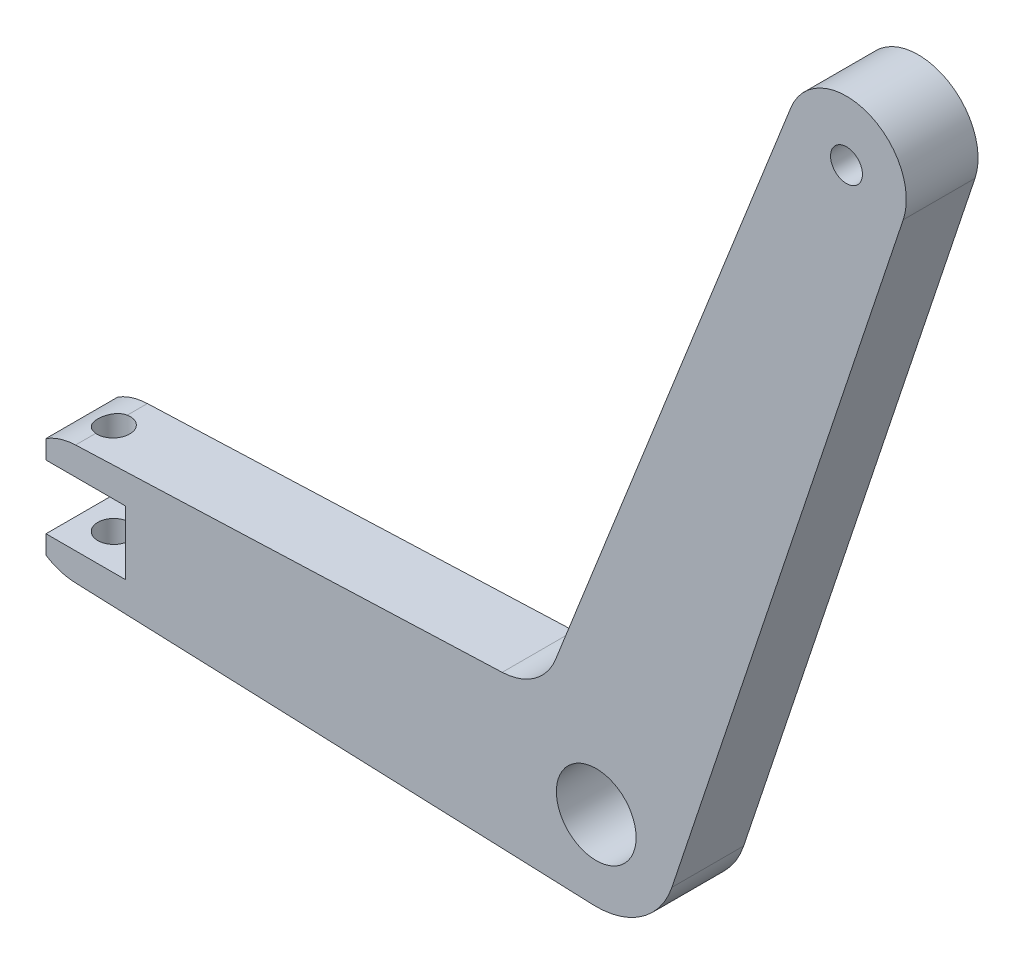
ISO-10303-21;
HEADER;
FILE_DESCRIPTION(('STEP AP214'),'2;1');
FILE_NAME('part.step','',(''),(''),'','','');
FILE_SCHEMA(('AUTOMOTIVE_DESIGN { 1 0 10303 214 1 1 1 1 }'));
ENDSEC;
DATA;
#1=APPLICATION_CONTEXT('core data for automotive mechanical design processes');
#2=APPLICATION_PROTOCOL_DEFINITION('international standard','automotive_design',2000,#1);
#3=PRODUCT_CONTEXT('',#1,'mechanical');
#4=PRODUCT('Part','Part','',(#3));
#5=PRODUCT_RELATED_PRODUCT_CATEGORY('part','',(#4));
#6=PRODUCT_DEFINITION_FORMATION('','',#4);
#7=PRODUCT_DEFINITION_CONTEXT('part definition',#1,'design');
#8=PRODUCT_DEFINITION('design','',#6,#7);
#9=PRODUCT_DEFINITION_SHAPE('','',#8);
#10=(LENGTH_UNIT() NAMED_UNIT(*) SI_UNIT(.MILLI.,.METRE.));
#11=(NAMED_UNIT(*) PLANE_ANGLE_UNIT() SI_UNIT($,.RADIAN.));
#12=(NAMED_UNIT(*) SI_UNIT($,.STERADIAN.) SOLID_ANGLE_UNIT());
#13=UNCERTAINTY_MEASURE_WITH_UNIT(LENGTH_MEASURE(1.E-05),#10,'distance_accuracy_value','');
#14=(GEOMETRIC_REPRESENTATION_CONTEXT(3) GLOBAL_UNCERTAINTY_ASSIGNED_CONTEXT((#13)) GLOBAL_UNIT_ASSIGNED_CONTEXT((#10,
#11,#12)) REPRESENTATION_CONTEXT('',''));
#15=CARTESIAN_POINT('',(0.,0.,0.));
#16=DIRECTION('',(0.,0.,1.));
#17=DIRECTION('',(1.,0.,0.));
#18=AXIS2_PLACEMENT_3D('',#15,#16,#17);
#19=CARTESIAN_POINT('',(-130.000001063068,0.,18.));
#20=DIRECTION('',(0.,0.,-1.));
#21=DIRECTION('',(-1.,0.,0.));
#22=AXIS2_PLACEMENT_3D('',#19,#20,#21);
#23=CYLINDRICAL_SURFACE('',#22,15.0000275579297);
#24=DIRECTION('',(0.,0.,-1.));
#25=VECTOR('',#24,1.);
#26=CARTESIAN_POINT('',(-138.000001063068,-12.6886101184744,18.));
#27=LINE('',#26,#25);
#28=CARTESIAN_POINT('',(-138.000001063068,-12.6886101184744,0.));
#29=VERTEX_POINT('',#28);
#30=CARTESIAN_POINT('',(-138.000001063068,-12.6886101184744,18.));
#31=VERTEX_POINT('',#30);
#32=EDGE_CURVE('E159',#29,#31,#27,.F.);
#33=ORIENTED_EDGE('',*,*,#32,.F.);
#34=CARTESIAN_POINT('',(-130.000001063068,0.,0.));
#35=DIRECTION('',(0.,0.,1.));
#36=DIRECTION('',(1.,0.,0.));
#37=AXIS2_PLACEMENT_3D('',#34,#35,#36);
#38=CIRCLE('',#37,15.0000275579297);
#39=CARTESIAN_POINT('',(-130.000001063068,-15.0000275579298,0.));
#40=VERTEX_POINT('',#39);
#41=EDGE_CURVE('E170',#29,#40,#38,.T.);
#42=ORIENTED_EDGE('',*,*,#41,.T.);
#43=DIRECTION('',(0.,0.,-1.));
#44=VECTOR('',#43,1.);
#45=CARTESIAN_POINT('',(-130.000001063068,-15.0000275579298,18.));
#46=LINE('',#45,#44);
#47=CARTESIAN_POINT('',(-130.000001063068,-15.0000275579298,5.00000000000015));
#48=VERTEX_POINT('',#47);
#49=EDGE_CURVE('E230',#48,#40,#46,.T.);
#50=ORIENTED_EDGE('',*,*,#49,.F.);
#51=CARTESIAN_POINT('',(-130.000001063068,-15.0000275579298,5.00000000000015));
#52=CARTESIAN_POINT('',(-130.110429979527,-15.000039127608,4.99998710210949));
#53=CARTESIAN_POINT('',(-130.220851327361,-14.9988083685536,5.00457281445147));
#54=CARTESIAN_POINT('',(-130.440867637331,-14.9939480538143,5.02284115458803));
#55=CARTESIAN_POINT('',(-130.550462736132,-14.9903189040452,5.03652224303738));
#56=CARTESIAN_POINT('',(-130.767830100226,-14.9807574286043,5.07284381274536));
#57=CARTESIAN_POINT('',(-130.875605642702,-14.9748298412933,5.09546586353631));
#58=CARTESIAN_POINT('',(-131.088771871688,-14.9608434648072,5.14945702650422));
#59=CARTESIAN_POINT('',(-131.194162525994,-14.9527846468714,5.18082625672313));
#60=CARTESIAN_POINT('',(-131.505635331047,-14.9257204333376,5.28770552813249));
#61=CARTESIAN_POINT('',(-131.707238194944,-14.9038169628393,5.37602423892251));
#62=CARTESIAN_POINT('',(-132.092702241525,-14.854606649301,5.58405724353521));
#63=CARTESIAN_POINT('',(-132.276558369622,-14.827298273564,5.70378044603293));
#64=CARTESIAN_POINT('',(-132.625644617796,-14.7695216039759,5.97416095273756));
#65=CARTESIAN_POINT('',(-132.790410472174,-14.7389996068464,6.12540722019662));
#66=CARTESIAN_POINT('',(-133.092568145137,-14.6785783796406,6.45328642458111));
#67=CARTESIAN_POINT('',(-133.22995455202,-14.6486792737261,6.62992436846132));
#68=CARTESIAN_POINT('',(-133.475731288655,-14.592338477779,7.00730226629842));
#69=CARTESIAN_POINT('',(-133.583583379343,-14.5659649492993,7.20840390975125));
#70=CARTESIAN_POINT('',(-133.763755229574,-14.520457203446,7.62669239863236));
#71=CARTESIAN_POINT('',(-133.836083311216,-14.5013212907803,7.84387546298362));
#72=CARTESIAN_POINT('',(-133.941538010621,-14.473011261013,8.28298992356108));
#73=CARTESIAN_POINT('',(-133.97551280972,-14.463621991182,8.50470341515122));
#74=CARTESIAN_POINT('',(-134.005940786888,-14.4552254853716,8.95087166682879));
#75=CARTESIAN_POINT('',(-134.002400140865,-14.4562165405512,9.17532596963881));
#76=CARTESIAN_POINT('',(-133.958569936521,-14.4682765182348,9.61397316821439));
#77=CARTESIAN_POINT('',(-133.919307630436,-14.4790637157923,9.82827768856916));
#78=CARTESIAN_POINT('',(-133.806793662827,-14.5090493428616,10.2471400543677));
#79=CARTESIAN_POINT('',(-133.733539610309,-14.5282483640598,10.4516972130612));
#80=CARTESIAN_POINT('',(-133.554286161926,-14.5731422138998,10.847939397374));
#81=CARTESIAN_POINT('',(-133.447926259859,-14.5989079619843,11.0394529393475));
#82=CARTESIAN_POINT('',(-133.205723959009,-14.6539940141355,11.4022740634708));
#83=CARTESIAN_POINT('',(-133.069876352553,-14.6833149456607,11.5735780682588));
#84=CARTESIAN_POINT('',(-132.767356632831,-14.7433747419667,11.8969578021659));
#85=CARTESIAN_POINT('',(-132.599825837379,-14.7741287110214,12.0482271550295));
#86=CARTESIAN_POINT('',(-132.241240303049,-14.8327523489024,12.3207663750534));
#87=CARTESIAN_POINT('',(-132.050179593653,-14.8606212823597,12.4420286045719));
#88=CARTESIAN_POINT('',(-131.749573939648,-14.8979922768469,12.5988768651268));
#89=CARTESIAN_POINT('',(-131.646709330984,-14.909738799854,12.6470911188178));
#90=CARTESIAN_POINT('',(-131.437099987471,-14.931397910713,12.734651230049));
#91=CARTESIAN_POINT('',(-131.3303568285,-14.9413112336521,12.7740006436528));
#92=CARTESIAN_POINT('',(-131.113862348789,-14.9590083309113,12.8434656421793));
#93=CARTESIAN_POINT('',(-131.004114171044,-14.9667942432556,12.8735905013809));
#94=CARTESIAN_POINT('',(-130.782357399181,-14.9800225138778,12.9243912461448));
#95=CARTESIAN_POINT('',(-130.670349871879,-14.9854659523044,12.9450714870277));
#96=CARTESIAN_POINT('',(-130.465259759482,-14.9930950512655,12.973944438159));
#97=CARTESIAN_POINT('',(-130.37241149341,-14.9956914544691,12.9837176224702));
#98=CARTESIAN_POINT('',(-130.186378297925,-14.9991591566028,12.9967431381919));
#99=CARTESIAN_POINT('',(-130.093194158364,-15.0000332455,13.0000060157202));
#100=CARTESIAN_POINT('',(-130.000001063068,-15.0000275579298,12.9999999999999));
#101=B_SPLINE_CURVE_WITH_KNOTS('',3,(#51,#52,#53,#54,#55,#56,#57,#58,#59,#60,#61,#62,#63,#64,
#65,#66,#67,#68,#69,#70,#71,#72,#73,#74,#75,#76,#77,#78,#79,#80,#81,#82,#83,#84,#85,#86,#87,#88,
#89,#90,#91,#92,#93,#94,#95,#96,#97,#98,#99,#100),.UNSPECIFIED.,.F.,.F.,(4,2,2,2,2,2,2,2,2,2,2,
2,2,2,2,2,2,2,2,2,2,2,2,2,4),(0.,0.331171669252462,0.662287303681064,0.992723922700853,
1.32316500113235,1.98338593550836,2.64379436110598,3.3178713990858,3.99208154032271,
4.67786534361418,5.36348841374275,6.03363222862638,6.70366572409995,7.35501976590737,
8.0064196312035,8.66517691308053,9.32405062950442,10.0043489690313,10.6848202855829,
11.0270976322766,11.3692374315536,11.7110321087008,12.0526690100435,12.3326239708219,
12.6121250600858),.UNSPECIFIED.);
#102=CARTESIAN_POINT('',(-130.000001063068,-15.0000275579298,12.9999999999999));
#103=VERTEX_POINT('',#102);
#104=EDGE_CURVE('E254',#48,#103,#101,.T.);
#105=ORIENTED_EDGE('',*,*,#104,.T.);
#106=CARTESIAN_POINT('',(-130.000001063068,-15.0000275579298,18.));
#107=VERTEX_POINT('',#106);
#108=EDGE_CURVE('E231',#107,#103,#46,.T.);
#109=ORIENTED_EDGE('',*,*,#108,.F.);
#110=CARTESIAN_POINT('',(-130.000001063068,0.,18.));
#111=DIRECTION('',(0.,0.,1.));
#112=DIRECTION('',(1.,0.,0.));
#113=AXIS2_PLACEMENT_3D('',#110,#111,#112);
#114=CIRCLE('',#113,15.0000275579297);
#115=EDGE_CURVE('E173',#31,#107,#114,.T.);
#116=ORIENTED_EDGE('',*,*,#115,.F.);
#117=EDGE_LOOP('',(#33,#42,#50,#105,#109,#116));
#118=FACE_BOUND('',#117,.T.);
#119=ADVANCED_FACE('F45',(#118),#23,.T.);
#120=DIRECTION('',(0.,0.,-1.));
#121=VECTOR('',#120,1.);
#122=CARTESIAN_POINT('',(-138.000001063068,12.6886101184744,18.));
#123=LINE('',#122,#121);
#124=CARTESIAN_POINT('',(-138.000001063068,12.6886101184744,18.));
#125=VERTEX_POINT('',#124);
#126=CARTESIAN_POINT('',(-138.000001063068,12.6886101184744,0.));
#127=VERTEX_POINT('',#126);
#128=EDGE_CURVE('E176',#125,#127,#123,.T.);
#129=ORIENTED_EDGE('',*,*,#128,.F.);
#130=CARTESIAN_POINT('',(-130.576922015427,14.9889288794557,18.));
#131=VERTEX_POINT('',#130);
#132=EDGE_CURVE('E343',#131,#125,#114,.T.);
#133=ORIENTED_EDGE('',*,*,#132,.F.);
#134=DIRECTION('',(0.,0.,-1.));
#135=VECTOR('',#134,1.);
#136=CARTESIAN_POINT('',(-130.576922015427,14.9889288794557,18.));
#137=LINE('',#136,#135);
#138=CARTESIAN_POINT('',(-130.576922015427,14.9889288794557,12.9581764725838));
#139=VERTEX_POINT('',#138);
#140=EDGE_CURVE('E236',#131,#139,#137,.T.);
#141=ORIENTED_EDGE('',*,*,#140,.T.);
#142=CARTESIAN_POINT('',(-130.576922015427,14.9889288794557,12.9581764725838));
#143=CARTESIAN_POINT('',(-130.68744737672,14.9846857074771,12.9420793196555));
#144=CARTESIAN_POINT('',(-130.797237430832,14.9792249173227,12.9213372040548));
#145=CARTESIAN_POINT('',(-131.014553238792,14.9660706943105,12.8708007940338));
#146=CARTESIAN_POINT('',(-131.122079486553,14.9583777539882,12.8410084965156));
#147=CARTESIAN_POINT('',(-131.333922380723,14.9409762891631,12.7726670196509));
#148=CARTESIAN_POINT('',(-131.438244726399,14.9312716141547,12.7341345517171));
#149=CARTESIAN_POINT('',(-131.643151036713,14.9101144161627,12.6486156236661));
#150=CARTESIAN_POINT('',(-131.743734882611,14.8986618377221,12.6016288953062));
#151=CARTESIAN_POINT('',(-132.038790088411,14.8621426053324,12.448523864488));
#152=CARTESIAN_POINT('',(-132.226825900542,14.8348918851816,12.3301761052217));
#153=CARTESIAN_POINT('',(-132.580445171669,14.7774952580895,12.0643641359232));
#154=CARTESIAN_POINT('',(-132.746021576904,14.7473484466359,11.9168908140609));
#155=CARTESIAN_POINT('',(-133.05382606557,14.68673230827,11.5932622575332));
#156=CARTESIAN_POINT('',(-133.195496524582,14.6562693263655,11.4165739851939));
#157=CARTESIAN_POINT('',(-133.447271614939,14.5991056780792,11.0414111477276));
#158=CARTESIAN_POINT('',(-133.557375240863,14.5724051315471,10.84293588895));
#159=CARTESIAN_POINT('',(-133.742596685806,14.5259410030507,10.4297403805196));
#160=CARTESIAN_POINT('',(-133.817751530188,14.5061700852101,10.2150376043137));
#161=CARTESIAN_POINT('',(-133.930676487137,14.4759830979541,9.7754053807407));
#162=CARTESIAN_POINT('',(-133.968457330881,14.4655643433365,9.55047888831664));
#163=CARTESIAN_POINT('',(-134.00468377711,14.4555760640433,9.10455838942624));
#164=CARTESIAN_POINT('',(-134.004357469081,14.4556678126625,8.88367116062964));
#165=CARTESIAN_POINT('',(-133.967441662279,14.4658425120589,8.44519650542797));
#166=CARTESIAN_POINT('',(-133.930853938209,14.4759249738719,8.2276089180614));
#167=CARTESIAN_POINT('',(-133.823361488348,14.504680345966,7.80461310920813));
#168=CARTESIAN_POINT('',(-133.752888893297,14.5232449399075,7.59908713242325));
#169=CARTESIAN_POINT('',(-133.580005288652,14.5668221124717,7.20268477654072));
#170=CARTESIAN_POINT('',(-133.477589806186,14.5918355940291,7.01181045374053));
#171=CARTESIAN_POINT('',(-133.240493108599,14.6463364563778,6.6445280670213));
#172=CARTESIAN_POINT('',(-133.105017160167,14.6759261895577,6.46864809081482));
#173=CARTESIAN_POINT('',(-132.806966265238,14.7358364926685,6.14169032310027));
#174=CARTESIAN_POINT('',(-132.644382268153,14.7661573037833,5.99062084864646));
#175=CARTESIAN_POINT('',(-132.291700735117,14.8250309889236,5.71373695717913));
#176=CARTESIAN_POINT('',(-132.101015854785,14.853520523924,5.58865023361676));
#177=CARTESIAN_POINT('',(-131.801020610469,14.8918565018312,5.42658547359376));
#178=CARTESIAN_POINT('',(-131.698696614495,14.9039018902928,5.37682558844982));
#179=CARTESIAN_POINT('',(-131.490028546574,14.9262062619696,5.28614286866096));
#180=CARTESIAN_POINT('',(-131.383685974446,14.9364659038044,5.24521677459258));
#181=CARTESIAN_POINT('',(-131.162142030628,14.9553742241694,5.17066863905417));
#182=CARTESIAN_POINT('',(-131.04676701371,14.9639120524243,5.1375342150036));
#183=CARTESIAN_POINT('',(-130.813515605507,14.9784102218698,5.08176218519333));
#184=CARTESIAN_POINT('',(-130.695642793137,14.9843740196503,5.05911049949937));
#185=CARTESIAN_POINT('',(-130.576922015427,14.9889288794557,5.04182352741618));
#186=B_SPLINE_CURVE_WITH_KNOTS('',3,(#142,#143,#144,#145,#146,#147,#148,#149,#150,#151,#152,
#153,#154,#155,#156,#157,#158,#159,#160,#161,#162,#163,#164,#165,#166,#167,#168,#169,#170,#171,
#172,#173,#174,#175,#176,#177,#178,#179,#180,#181,#182,#183,#184,#185),.UNSPECIFIED.,.F.,.F.,(4,
2,2,2,2,2,2,2,2,2,2,2,2,2,2,2,2,2,2,2,2,4),(0.,0.335192644075447,0.670311382300934,
1.0047946875275,1.33928860734079,2.00746147417339,2.67584370861998,3.35813590505799,
4.04044983050835,4.72203924429065,5.40343289679829,6.06287334987864,6.72228153029949,
7.37349481277645,8.02479932380347,8.69364569048698,9.3627158143066,10.0485513992621,
10.3914540959462,10.7342300539617,11.0947455606754,11.4547754239235),.UNSPECIFIED.);
#187=CARTESIAN_POINT('',(-130.576922015427,14.9889288794557,5.04182352741619));
#188=VERTEX_POINT('',#187);
#189=EDGE_CURVE('E259',#139,#188,#186,.T.);
#190=ORIENTED_EDGE('',*,*,#189,.T.);
#191=CARTESIAN_POINT('',(-130.576922015427,14.9889288794557,0.));
#192=VERTEX_POINT('',#191);
#193=EDGE_CURVE('E235',#188,#192,#137,.T.);
#194=ORIENTED_EDGE('',*,*,#193,.T.);
#195=EDGE_CURVE('E183',#192,#127,#38,.T.);
#196=ORIENTED_EDGE('',*,*,#195,.T.);
#197=EDGE_LOOP('',(#129,#133,#141,#190,#194,#196));
#198=FACE_BOUND('',#197,.T.);
#199=ADVANCED_FACE('F304',(#198),#23,.T.);
#200=CARTESIAN_POINT('',(-24.1604405382243,34.0959853951472,18.));
#201=DIRECTION('',(0.,0.,-1.));
#202=DIRECTION('',(-1.,0.,0.));
#203=AXIS2_PLACEMENT_3D('',#200,#201,#202);
#204=PLANE('',#203);
#205=CARTESIAN_POINT('',(0.,0.,18.));
#206=DIRECTION('',(0.,0.,1.));
#207=DIRECTION('',(1.,0.,0.));
#208=AXIS2_PLACEMENT_3D('',#205,#206,#207);
#209=CIRCLE('',#208,10.);
#210=CARTESIAN_POINT('',(10.,0.,18.));
#211=VERTEX_POINT('',#210);
#212=EDGE_CURVE('E374',#211,#211,#209,.T.);
#213=ORIENTED_EDGE('',*,*,#212,.F.);
#214=EDGE_LOOP('',(#213));
#215=FACE_BOUND('',#214,.T.);
#216=CARTESIAN_POINT('',(62.7606963002596,172.433595914214,18.));
#217=DIRECTION('',(0.,0.,1.));
#218=DIRECTION('',(1.,0.,0.));
#219=AXIS2_PLACEMENT_3D('',#216,#217,#218);
#220=CIRCLE('',#219,4.00000000000001);
#221=CARTESIAN_POINT('',(66.7606963002596,172.433595914214,18.));
#222=VERTEX_POINT('',#221);
#223=EDGE_CURVE('E391',#222,#222,#220,.T.);
#224=ORIENTED_EDGE('',*,*,#223,.F.);
#225=EDGE_LOOP('',(#224));
#226=FACE_BOUND('',#225,.T.);
#227=DIRECTION('',(0.,1.,0.));
#228=VECTOR('',#227,1.);
#229=CARTESIAN_POINT('',(-138.000001063068,20.,18.));
#230=LINE('',#229,#228);
#231=CARTESIAN_POINT('',(-138.000001063068,-8.,18.));
#232=VERTEX_POINT('',#231);
#233=EDGE_CURVE('E61',#31,#232,#230,.T.);
#234=ORIENTED_EDGE('',*,*,#233,.F.);
#235=ORIENTED_EDGE('',*,*,#115,.T.);
#236=DIRECTION('',(0.999256785054639,-0.0385470818904151,0.));
#237=VECTOR('',#236,1.);
#238=CARTESIAN_POINT('',(-130.000001063068,-15.0000275579298,18.));
#239=LINE('',#238,#237);
#240=CARTESIAN_POINT('',(-0.770941637808299,-19.9851357010928,18.));
#241=VERTEX_POINT('',#240);
#242=EDGE_CURVE('E354',#107,#241,#239,.T.);
#243=ORIENTED_EDGE('',*,*,#242,.T.);
#244=CARTESIAN_POINT('',(0.,0.,18.));
#245=DIRECTION('',(0.,0.,1.));
#246=DIRECTION('',(1.,0.,0.));
#247=AXIS2_PLACEMENT_3D('',#244,#245,#246);
#248=CIRCLE('',#247,20.);
#249=CARTESIAN_POINT('',(18.973261360885,-6.3257689913201,18.));
#250=VERTEX_POINT('',#249);
#251=EDGE_CURVE('E358',#241,#250,#248,.T.);
#252=ORIENTED_EDGE('',*,*,#251,.T.);
#253=DIRECTION('',(0.316288449566005,0.948663068044252,0.));
#254=VECTOR('',#253,1.);
#255=CARTESIAN_POINT('',(76.9906423209235,167.689269170724,18.));
#256=LINE('',#255,#254);
#257=CARTESIAN_POINT('',(76.9906423209235,167.689269170724,18.));
#258=VERTEX_POINT('',#257);
#259=EDGE_CURVE('E365',#250,#258,#256,.T.);
#260=ORIENTED_EDGE('',*,*,#259,.T.);
#261=CARTESIAN_POINT('',(62.7606963002597,172.433595914214,18.));
#262=DIRECTION('',(0.,0.,1.));
#263=DIRECTION('',(1.,0.,0.));
#264=AXIS2_PLACEMENT_3D('',#261,#262,#263);
#265=CIRCLE('',#264,15.);
#266=CARTESIAN_POINT('',(48.8103307782272,177.946063764614,18.));
#267=VERTEX_POINT('',#266);
#268=EDGE_CURVE('E368',#258,#267,#265,.T.);
#269=ORIENTED_EDGE('',*,*,#268,.T.);
#270=DIRECTION('',(-0.367497856693302,-0.930024368135496,0.));
#271=VECTOR('',#270,1.);
#272=CARTESIAN_POINT('',(48.8103307782272,177.946063764614,18.));
#273=LINE('',#272,#271);
#274=CARTESIAN_POINT('',(-10.2100750161918,28.5835175447477,18.));
#275=VERTEX_POINT('',#274);
#276=EDGE_CURVE('E214',#267,#275,#273,.T.);
#277=ORIENTED_EDGE('',*,*,#276,.T.);
#278=CARTESIAN_POINT('',(-24.1604405382243,34.0959853951472,18.));
#279=DIRECTION('',(0.,0.,-1.));
#280=DIRECTION('',(-1.,0.,0.));
#281=AXIS2_PLACEMENT_3D('',#278,#279,#280);
#282=CIRCLE('',#281,15.);
#283=CARTESIAN_POINT('',(-23.5835206457801,19.1070840532308,18.));
#284=VERTEX_POINT('',#283);
#285=EDGE_CURVE('E208',#275,#284,#282,.T.);
#286=ORIENTED_EDGE('',*,*,#285,.T.);
#287=DIRECTION('',(-0.999260089461091,-0.0384613261629483,0.));
#288=VECTOR('',#287,1.);
#289=CARTESIAN_POINT('',(-130.576922015427,14.9889288794557,18.));
#290=LINE('',#289,#288);
#291=EDGE_CURVE('E351',#284,#131,#290,.T.);
#292=ORIENTED_EDGE('',*,*,#291,.T.);
#293=ORIENTED_EDGE('',*,*,#132,.T.);
#294=CARTESIAN_POINT('',(-138.000001063068,8.,18.));
#295=VERTEX_POINT('',#294);
#296=EDGE_CURVE('E165',#295,#125,#230,.T.);
#297=ORIENTED_EDGE('',*,*,#296,.F.);
#298=DIRECTION('',(1.,0.,0.));
#299=VECTOR('',#298,1.);
#300=CARTESIAN_POINT('',(-146.,8.,18.));
#301=LINE('',#300,#299);
#302=CARTESIAN_POINT('',(-118.,8.,18.));
#303=VERTEX_POINT('',#302);
#304=EDGE_CURVE('E548',#295,#303,#301,.T.);
#305=ORIENTED_EDGE('',*,*,#304,.T.);
#306=DIRECTION('',(0.,-1.,0.));
#307=VECTOR('',#306,1.);
#308=CARTESIAN_POINT('',(-118.,-8.,18.));
#309=LINE('',#308,#307);
#310=CARTESIAN_POINT('',(-118.,-8.,18.));
#311=VERTEX_POINT('',#310);
#312=EDGE_CURVE('E541',#303,#311,#309,.T.);
#313=ORIENTED_EDGE('',*,*,#312,.T.);
#314=DIRECTION('',(1.,0.,0.));
#315=VECTOR('',#314,1.);
#316=CARTESIAN_POINT('',(-146.,-8.,18.));
#317=LINE('',#316,#315);
#318=EDGE_CURVE('E251',#232,#311,#317,.T.);
#319=ORIENTED_EDGE('',*,*,#318,.F.);
#320=EDGE_LOOP('',(#234,#235,#243,#252,#260,#269,#277,#286,#292,#293,#297,#305,#313,#319));
#321=FACE_BOUND('',#320,.T.);
#322=ADVANCED_FACE('F301',(#215,#226,#321),#204,.F.);
#323=CARTESIAN_POINT('',(-24.1604405382243,34.0959853951472,0.));
#324=DIRECTION('',(0.,0.,-1.));
#325=DIRECTION('',(-1.,0.,0.));
#326=AXIS2_PLACEMENT_3D('',#323,#324,#325);
#327=PLANE('',#326);
#328=CARTESIAN_POINT('',(0.,0.,0.));
#329=DIRECTION('',(0.,0.,1.));
#330=DIRECTION('',(1.,0.,0.));
#331=AXIS2_PLACEMENT_3D('',#328,#329,#330);
#332=CIRCLE('',#331,10.);
#333=CARTESIAN_POINT('',(10.,0.,0.));
#334=VERTEX_POINT('',#333);
#335=EDGE_CURVE('E380',#334,#334,#332,.T.);
#336=ORIENTED_EDGE('',*,*,#335,.T.);
#337=EDGE_LOOP('',(#336));
#338=FACE_BOUND('',#337,.T.);
#339=CARTESIAN_POINT('',(62.7606963002596,172.433595914214,0.));
#340=DIRECTION('',(0.,0.,1.));
#341=DIRECTION('',(1.,0.,0.));
#342=AXIS2_PLACEMENT_3D('',#339,#340,#341);
#343=CIRCLE('',#342,4.00000000000001);
#344=CARTESIAN_POINT('',(66.7606963002596,172.433595914214,0.));
#345=VERTEX_POINT('',#344);
#346=EDGE_CURVE('E385',#345,#345,#343,.T.);
#347=ORIENTED_EDGE('',*,*,#346,.T.);
#348=EDGE_LOOP('',(#347));
#349=FACE_BOUND('',#348,.T.);
#350=ORIENTED_EDGE('',*,*,#41,.F.);
#351=DIRECTION('',(0.,1.,0.));
#352=VECTOR('',#351,1.);
#353=CARTESIAN_POINT('',(-138.000001063068,20.,0.));
#354=LINE('',#353,#352);
#355=CARTESIAN_POINT('',(-138.000001063068,-8.,0.));
#356=VERTEX_POINT('',#355);
#357=EDGE_CURVE('E156',#29,#356,#354,.T.);
#358=ORIENTED_EDGE('',*,*,#357,.T.);
#359=DIRECTION('',(1.,0.,0.));
#360=VECTOR('',#359,1.);
#361=CARTESIAN_POINT('',(-146.,-8.,0.));
#362=LINE('',#361,#360);
#363=CARTESIAN_POINT('',(-118.,-8.,0.));
#364=VERTEX_POINT('',#363);
#365=EDGE_CURVE('E272',#356,#364,#362,.T.);
#366=ORIENTED_EDGE('',*,*,#365,.T.);
#367=DIRECTION('',(0.,1.,0.));
#368=VECTOR('',#367,1.);
#369=CARTESIAN_POINT('',(-118.,8.,0.));
#370=LINE('',#369,#368);
#371=CARTESIAN_POINT('',(-118.,8.,0.));
#372=VERTEX_POINT('',#371);
#373=EDGE_CURVE('E543',#364,#372,#370,.T.);
#374=ORIENTED_EDGE('',*,*,#373,.T.);
#375=DIRECTION('',(1.,0.,0.));
#376=VECTOR('',#375,1.);
#377=CARTESIAN_POINT('',(-146.,8.,0.));
#378=LINE('',#377,#376);
#379=CARTESIAN_POINT('',(-138.000001063068,8.,0.));
#380=VERTEX_POINT('',#379);
#381=EDGE_CURVE('E555',#380,#372,#378,.T.);
#382=ORIENTED_EDGE('',*,*,#381,.F.);
#383=EDGE_CURVE('E68',#380,#127,#354,.T.);
#384=ORIENTED_EDGE('',*,*,#383,.T.);
#385=ORIENTED_EDGE('',*,*,#195,.F.);
#386=DIRECTION('',(-0.999260089461091,-0.0384613261629483,0.));
#387=VECTOR('',#386,1.);
#388=CARTESIAN_POINT('',(-130.576922015427,14.9889288794557,0.));
#389=LINE('',#388,#387);
#390=CARTESIAN_POINT('',(-23.5835206457801,19.1070840532308,0.));
#391=VERTEX_POINT('',#390);
#392=EDGE_CURVE('E184',#391,#192,#389,.T.);
#393=ORIENTED_EDGE('',*,*,#392,.F.);
#394=CARTESIAN_POINT('',(-24.1604405382243,34.0959853951472,0.));
#395=DIRECTION('',(0.,0.,-1.));
#396=DIRECTION('',(-1.,0.,0.));
#397=AXIS2_PLACEMENT_3D('',#394,#395,#396);
#398=CIRCLE('',#397,15.);
#399=CARTESIAN_POINT('',(-10.2100750161918,28.5835175447477,0.));
#400=VERTEX_POINT('',#399);
#401=EDGE_CURVE('E190',#400,#391,#398,.T.);
#402=ORIENTED_EDGE('',*,*,#401,.F.);
#403=DIRECTION('',(-0.367497856693302,-0.930024368135496,0.));
#404=VECTOR('',#403,1.);
#405=CARTESIAN_POINT('',(48.8103307782272,177.946063764614,0.));
#406=LINE('',#405,#404);
#407=CARTESIAN_POINT('',(48.8103307782272,177.946063764614,0.));
#408=VERTEX_POINT('',#407);
#409=EDGE_CURVE('E205',#408,#400,#406,.T.);
#410=ORIENTED_EDGE('',*,*,#409,.F.);
#411=CARTESIAN_POINT('',(62.7606963002597,172.433595914214,0.));
#412=DIRECTION('',(0.,0.,1.));
#413=DIRECTION('',(1.,0.,0.));
#414=AXIS2_PLACEMENT_3D('',#411,#412,#413);
#415=CIRCLE('',#414,15.);
#416=CARTESIAN_POINT('',(76.9906423209235,167.689269170724,0.));
#417=VERTEX_POINT('',#416);
#418=EDGE_CURVE('E202',#417,#408,#415,.T.);
#419=ORIENTED_EDGE('',*,*,#418,.F.);
#420=DIRECTION('',(0.316288449566005,0.948663068044252,0.));
#421=VECTOR('',#420,1.);
#422=CARTESIAN_POINT('',(76.9906423209235,167.689269170724,0.));
#423=LINE('',#422,#421);
#424=CARTESIAN_POINT('',(18.973261360885,-6.3257689913201,0.));
#425=VERTEX_POINT('',#424);
#426=EDGE_CURVE('E199',#425,#417,#423,.T.);
#427=ORIENTED_EDGE('',*,*,#426,.F.);
#428=CARTESIAN_POINT('',(0.,0.,0.));
#429=DIRECTION('',(0.,0.,1.));
#430=DIRECTION('',(1.,0.,0.));
#431=AXIS2_PLACEMENT_3D('',#428,#429,#430);
#432=CIRCLE('',#431,20.);
#433=CARTESIAN_POINT('',(-0.770941637808299,-19.9851357010928,0.));
#434=VERTEX_POINT('',#433);
#435=EDGE_CURVE('E196',#434,#425,#432,.T.);
#436=ORIENTED_EDGE('',*,*,#435,.F.);
#437=DIRECTION('',(0.999256785054639,-0.0385470818904151,0.));
#438=VECTOR('',#437,1.);
#439=CARTESIAN_POINT('',(-130.000001063068,-15.0000275579298,0.));
#440=LINE('',#439,#438);
#441=EDGE_CURVE('E181',#40,#434,#440,.T.);
#442=ORIENTED_EDGE('',*,*,#441,.F.);
#443=EDGE_LOOP('',(#350,#358,#366,#374,#382,#384,#385,#393,#402,#410,#419,#427,#436,#442));
#444=FACE_BOUND('',#443,.T.);
#445=ADVANCED_FACE('F179',(#338,#349,#444),#327,.T.);
#446=CARTESIAN_POINT('',(-146.,-8.,18.));
#447=DIRECTION('',(0.,-1.,0.));
#448=DIRECTION('',(0.,0.,-1.));
#449=AXIS2_PLACEMENT_3D('',#446,#447,#448);
#450=PLANE('',#449);
#451=CARTESIAN_POINT('',(-130.,-8.,9.));
#452=DIRECTION('',(0.,-1.,0.));
#453=DIRECTION('',(0.,0.,-1.));
#454=AXIS2_PLACEMENT_3D('',#451,#452,#453);
#455=CIRCLE('',#454,3.99999999999999);
#456=CARTESIAN_POINT('',(-130.,-8.,5.00000000000001));
#457=VERTEX_POINT('',#456);
#458=EDGE_CURVE('E250',#457,#457,#455,.F.);
#459=ORIENTED_EDGE('',*,*,#458,.F.);
#460=EDGE_LOOP('',(#459));
#461=FACE_BOUND('',#460,.T.);
#462=DIRECTION('',(0.,0.,-1.));
#463=VECTOR('',#462,1.);
#464=CARTESIAN_POINT('',(-138.000001063068,-8.,18.));
#465=LINE('',#464,#463);
#466=EDGE_CURVE('E160',#232,#356,#465,.T.);
#467=ORIENTED_EDGE('',*,*,#466,.F.);
#468=ORIENTED_EDGE('',*,*,#318,.T.);
#469=DIRECTION('',(0.,0.,-1.));
#470=VECTOR('',#469,1.);
#471=CARTESIAN_POINT('',(-118.,-8.,18.));
#472=LINE('',#471,#470);
#473=EDGE_CURVE('E175',#311,#364,#472,.T.);
#474=ORIENTED_EDGE('',*,*,#473,.T.);
#475=ORIENTED_EDGE('',*,*,#365,.F.);
#476=EDGE_LOOP('',(#467,#468,#474,#475));
#477=FACE_BOUND('',#476,.T.);
#478=ADVANCED_FACE('F290',(#461,#477),#450,.F.);
#479=CARTESIAN_POINT('',(-146.,8.,18.));
#480=DIRECTION('',(0.,1.,0.));
#481=DIRECTION('',(0.,0.,1.));
#482=AXIS2_PLACEMENT_3D('',#479,#480,#481);
#483=PLANE('',#482);
#484=CARTESIAN_POINT('',(-130.,8.,9.));
#485=DIRECTION('',(0.,1.,0.));
#486=DIRECTION('',(0.,0.,1.));
#487=AXIS2_PLACEMENT_3D('',#484,#485,#486);
#488=CIRCLE('',#487,3.99999999999999);
#489=CARTESIAN_POINT('',(-130.,8.,13.));
#490=VERTEX_POINT('',#489);
#491=EDGE_CURVE('E247',#490,#490,#488,.F.);
#492=ORIENTED_EDGE('',*,*,#491,.F.);
#493=EDGE_LOOP('',(#492));
#494=FACE_BOUND('',#493,.T.);
#495=DIRECTION('',(0.,0.,1.));
#496=VECTOR('',#495,1.);
#497=CARTESIAN_POINT('',(-138.000001063068,8.,18.));
#498=LINE('',#497,#496);
#499=EDGE_CURVE('E11',#380,#295,#498,.T.);
#500=ORIENTED_EDGE('',*,*,#499,.F.);
#501=ORIENTED_EDGE('',*,*,#381,.T.);
#502=DIRECTION('',(0.,0.,1.));
#503=VECTOR('',#502,1.);
#504=CARTESIAN_POINT('',(-118.,8.,18.));
#505=LINE('',#504,#503);
#506=EDGE_CURVE('E551',#372,#303,#505,.T.);
#507=ORIENTED_EDGE('',*,*,#506,.T.);
#508=ORIENTED_EDGE('',*,*,#304,.F.);
#509=EDGE_LOOP('',(#500,#501,#507,#508));
#510=FACE_BOUND('',#509,.T.);
#511=ADVANCED_FACE('F407',(#494,#510),#483,.F.);
#512=CARTESIAN_POINT('',(-130.,-20.,9.));
#513=DIRECTION('',(0.,1.,0.));
#514=DIRECTION('',(0.,0.,1.));
#515=AXIS2_PLACEMENT_3D('',#512,#513,#514);
#516=CYLINDRICAL_SURFACE('',#515,3.99999999999999);
#517=ORIENTED_EDGE('',*,*,#458,.T.);
#518=EDGE_LOOP('',(#517));
#519=FACE_BOUND('',#518,.T.);
#520=CARTESIAN_POINT('',(-130.,-15.0000275989384,9.));
#521=DIRECTION('',(0.0385470818904151,0.999256785054639,0.));
#522=DIRECTION('',(-0.999256785054639,0.0385470818904151,0.));
#523=AXIS2_PLACEMENT_3D('',#520,#521,#522);
#524=ELLIPSE('',#523,4.00297507089859,3.99999999999999);
#525=EDGE_CURVE('E54',#103,#48,#524,.T.);
#526=ORIENTED_EDGE('',*,*,#525,.F.);
#527=ORIENTED_EDGE('',*,*,#104,.F.);
#528=EDGE_LOOP('',(#526,#527));
#529=FACE_BOUND('',#528,.T.);
#530=ADVANCED_FACE('F289',(#519,#529),#516,.F.);
#531=CARTESIAN_POINT('',(-24.1604405382243,34.0959853951472,18.));
#532=DIRECTION('',(0.,0.,-1.));
#533=DIRECTION('',(-1.,0.,0.));
#534=AXIS2_PLACEMENT_3D('',#531,#532,#533);
#535=CYLINDRICAL_SURFACE('',#534,15.);
#536=ORIENTED_EDGE('',*,*,#401,.T.);
#537=DIRECTION('',(0.,0.,-1.));
#538=VECTOR('',#537,1.);
#539=CARTESIAN_POINT('',(-23.5835206457801,19.1070840532308,18.));
#540=LINE('',#539,#538);
#541=EDGE_CURVE('E240',#284,#391,#540,.T.);
#542=ORIENTED_EDGE('',*,*,#541,.F.);
#543=ORIENTED_EDGE('',*,*,#285,.F.);
#544=DIRECTION('',(0.,0.,-1.));
#545=VECTOR('',#544,1.);
#546=CARTESIAN_POINT('',(-10.2100750161918,28.5835175447477,18.));
#547=LINE('',#546,#545);
#548=EDGE_CURVE('E209',#275,#400,#547,.T.);
#549=ORIENTED_EDGE('',*,*,#548,.T.);
#550=EDGE_LOOP('',(#536,#542,#543,#549));
#551=FACE_BOUND('',#550,.T.);
#552=ADVANCED_FACE('F47',(#551),#535,.F.);
#553=CARTESIAN_POINT('',(-130.576922015427,14.9889288794557,18.));
#554=DIRECTION('',(0.0384613261629483,-0.999260089461091,0.));
#555=DIRECTION('',(0.999260089461091,0.0384613261629483,0.));
#556=AXIS2_PLACEMENT_3D('',#553,#554,#555);
#557=PLANE('',#556);
#558=ORIENTED_EDGE('',*,*,#193,.F.);
#559=CARTESIAN_POINT('',(-130.,15.0111344954309,9.));
#560=DIRECTION('',(0.0384613261629483,-0.999260089461091,0.));
#561=DIRECTION('',(0.999260089461091,0.0384613261629483,0.));
#562=AXIS2_PLACEMENT_3D('',#559,#560,#561);
#563=ELLIPSE('',#562,4.00296183364756,3.99999999999999);
#564=EDGE_CURVE('E263',#188,#139,#563,.T.);
#565=ORIENTED_EDGE('',*,*,#564,.T.);
#566=ORIENTED_EDGE('',*,*,#140,.F.);
#567=ORIENTED_EDGE('',*,*,#291,.F.);
#568=ORIENTED_EDGE('',*,*,#541,.T.);
#569=ORIENTED_EDGE('',*,*,#392,.T.);
#570=EDGE_LOOP('',(#558,#565,#566,#567,#568,#569));
#571=FACE_BOUND('',#570,.T.);
#572=ADVANCED_FACE('F325',(#571),#557,.F.);
#573=CARTESIAN_POINT('',(-130.000001063068,-15.0000275579298,18.));
#574=DIRECTION('',(0.0385470818904151,0.999256785054639,0.));
#575=DIRECTION('',(-0.999256785054639,0.0385470818904151,0.));
#576=AXIS2_PLACEMENT_3D('',#573,#574,#575);
#577=PLANE('',#576);
#578=ORIENTED_EDGE('',*,*,#108,.T.);
#579=ORIENTED_EDGE('',*,*,#525,.T.);
#580=ORIENTED_EDGE('',*,*,#49,.T.);
#581=ORIENTED_EDGE('',*,*,#441,.T.);
#582=DIRECTION('',(0.,0.,-1.));
#583=VECTOR('',#582,1.);
#584=CARTESIAN_POINT('',(-0.770941637808299,-19.9851357010928,18.));
#585=LINE('',#584,#583);
#586=EDGE_CURVE('E226',#241,#434,#585,.T.);
#587=ORIENTED_EDGE('',*,*,#586,.F.);
#588=ORIENTED_EDGE('',*,*,#242,.F.);
#589=EDGE_LOOP('',(#578,#579,#580,#581,#587,#588));
#590=FACE_BOUND('',#589,.T.);
#591=ADVANCED_FACE('F322',(#590),#577,.F.);
#592=CARTESIAN_POINT('',(0.,0.,18.));
#593=DIRECTION('',(0.,0.,-1.));
#594=DIRECTION('',(-1.,0.,0.));
#595=AXIS2_PLACEMENT_3D('',#592,#593,#594);
#596=CYLINDRICAL_SURFACE('',#595,20.);
#597=ORIENTED_EDGE('',*,*,#435,.T.);
#598=DIRECTION('',(0.,0.,-1.));
#599=VECTOR('',#598,1.);
#600=CARTESIAN_POINT('',(18.973261360885,-6.3257689913201,18.));
#601=LINE('',#600,#599);
#602=EDGE_CURVE('E222',#250,#425,#601,.T.);
#603=ORIENTED_EDGE('',*,*,#602,.F.);
#604=ORIENTED_EDGE('',*,*,#251,.F.);
#605=ORIENTED_EDGE('',*,*,#586,.T.);
#606=EDGE_LOOP('',(#597,#603,#604,#605));
#607=FACE_BOUND('',#606,.T.);
#608=ADVANCED_FACE('F319',(#607),#596,.T.);
#609=CARTESIAN_POINT('',(76.9906423209235,167.689269170724,18.));
#610=DIRECTION('',(-0.948663068044252,0.316288449566005,0.));
#611=DIRECTION('',(-0.316288449566005,-0.948663068044252,0.));
#612=AXIS2_PLACEMENT_3D('',#609,#610,#611);
#613=PLANE('',#612);
#614=ORIENTED_EDGE('',*,*,#426,.T.);
#615=DIRECTION('',(0.,0.,-1.));
#616=VECTOR('',#615,1.);
#617=CARTESIAN_POINT('',(76.9906423209235,167.689269170724,18.));
#618=LINE('',#617,#616);
#619=EDGE_CURVE('E218',#258,#417,#618,.T.);
#620=ORIENTED_EDGE('',*,*,#619,.F.);
#621=ORIENTED_EDGE('',*,*,#259,.F.);
#622=ORIENTED_EDGE('',*,*,#602,.T.);
#623=EDGE_LOOP('',(#614,#620,#621,#622));
#624=FACE_BOUND('',#623,.T.);
#625=ADVANCED_FACE('F315',(#624),#613,.F.);
#626=CARTESIAN_POINT('',(62.7606963002597,172.433595914214,18.));
#627=DIRECTION('',(0.,0.,-1.));
#628=DIRECTION('',(-1.,0.,0.));
#629=AXIS2_PLACEMENT_3D('',#626,#627,#628);
#630=CYLINDRICAL_SURFACE('',#629,15.);
#631=ORIENTED_EDGE('',*,*,#418,.T.);
#632=DIRECTION('',(0.,0.,-1.));
#633=VECTOR('',#632,1.);
#634=CARTESIAN_POINT('',(48.8103307782272,177.946063764614,18.));
#635=LINE('',#634,#633);
#636=EDGE_CURVE('E213',#267,#408,#635,.T.);
#637=ORIENTED_EDGE('',*,*,#636,.F.);
#638=ORIENTED_EDGE('',*,*,#268,.F.);
#639=ORIENTED_EDGE('',*,*,#619,.T.);
#640=EDGE_LOOP('',(#631,#637,#638,#639));
#641=FACE_BOUND('',#640,.T.);
#642=ADVANCED_FACE('F311',(#641),#630,.T.);
#643=CARTESIAN_POINT('',(48.8103307782272,177.946063764614,18.));
#644=DIRECTION('',(0.930024368135496,-0.367497856693302,0.));
#645=DIRECTION('',(0.367497856693302,0.930024368135496,0.));
#646=AXIS2_PLACEMENT_3D('',#643,#644,#645);
#647=PLANE('',#646);
#648=ORIENTED_EDGE('',*,*,#409,.T.);
#649=ORIENTED_EDGE('',*,*,#548,.F.);
#650=ORIENTED_EDGE('',*,*,#276,.F.);
#651=ORIENTED_EDGE('',*,*,#636,.T.);
#652=EDGE_LOOP('',(#648,#649,#650,#651));
#653=FACE_BOUND('',#652,.T.);
#654=ADVANCED_FACE('F299',(#653),#647,.F.);
#655=CARTESIAN_POINT('',(62.7606963002596,172.433595914214,18.));
#656=DIRECTION('',(0.,0.,-1.));
#657=DIRECTION('',(-1.,0.,0.));
#658=AXIS2_PLACEMENT_3D('',#655,#656,#657);
#659=CYLINDRICAL_SURFACE('',#658,4.00000000000001);
#660=ORIENTED_EDGE('',*,*,#223,.T.);
#661=EDGE_LOOP('',(#660));
#662=FACE_BOUND('',#661,.T.);
#663=ORIENTED_EDGE('',*,*,#346,.F.);
#664=EDGE_LOOP('',(#663));
#665=FACE_BOUND('',#664,.T.);
#666=ADVANCED_FACE('F295',(#662,#665),#659,.F.);
#667=CARTESIAN_POINT('',(0.,0.,18.));
#668=DIRECTION('',(0.,0.,-1.));
#669=DIRECTION('',(-1.,0.,0.));
#670=AXIS2_PLACEMENT_3D('',#667,#668,#669);
#671=CYLINDRICAL_SURFACE('',#670,10.);
#672=ORIENTED_EDGE('',*,*,#212,.T.);
#673=EDGE_LOOP('',(#672));
#674=FACE_BOUND('',#673,.T.);
#675=ORIENTED_EDGE('',*,*,#335,.F.);
#676=EDGE_LOOP('',(#675));
#677=FACE_BOUND('',#676,.T.);
#678=ADVANCED_FACE('F287',(#674,#677),#671,.F.);
#679=ORIENTED_EDGE('',*,*,#491,.T.);
#680=EDGE_LOOP('',(#679));
#681=FACE_BOUND('',#680,.T.);
#682=ORIENTED_EDGE('',*,*,#189,.F.);
#683=ORIENTED_EDGE('',*,*,#564,.F.);
#684=EDGE_LOOP('',(#682,#683));
#685=FACE_BOUND('',#684,.T.);
#686=ADVANCED_FACE('F281',(#681,#685),#516,.F.);
#687=CARTESIAN_POINT('',(-118.,0.,0.));
#688=DIRECTION('',(-1.,0.,0.));
#689=DIRECTION('',(0.,0.,1.));
#690=AXIS2_PLACEMENT_3D('',#687,#688,#689);
#691=PLANE('',#690);
#692=ORIENTED_EDGE('',*,*,#473,.F.);
#693=ORIENTED_EDGE('',*,*,#312,.F.);
#694=ORIENTED_EDGE('',*,*,#506,.F.);
#695=ORIENTED_EDGE('',*,*,#373,.F.);
#696=EDGE_LOOP('',(#692,#693,#694,#695));
#697=FACE_BOUND('',#696,.T.);
#698=ADVANCED_FACE('F286',(#697),#691,.T.);
#699=CARTESIAN_POINT('',(-138.000001063068,20.,18.));
#700=DIRECTION('',(-1.,0.,0.));
#701=DIRECTION('',(0.,0.,1.));
#702=AXIS2_PLACEMENT_3D('',#699,#700,#701);
#703=PLANE('',#702);
#704=ORIENTED_EDGE('',*,*,#128,.T.);
#705=ORIENTED_EDGE('',*,*,#383,.F.);
#706=ORIENTED_EDGE('',*,*,#499,.T.);
#707=ORIENTED_EDGE('',*,*,#296,.T.);
#708=EDGE_LOOP('',(#704,#705,#706,#707));
#709=FACE_BOUND('',#708,.T.);
#710=ADVANCED_FACE('F422',(#709),#703,.T.);
#711=ORIENTED_EDGE('',*,*,#32,.T.);
#712=ORIENTED_EDGE('',*,*,#233,.T.);
#713=ORIENTED_EDGE('',*,*,#466,.T.);
#714=ORIENTED_EDGE('',*,*,#357,.F.);
#715=EDGE_LOOP('',(#711,#712,#713,#714));
#716=FACE_BOUND('',#715,.T.);
#717=ADVANCED_FACE('F158',(#716),#703,.T.);
#718=CLOSED_SHELL('',(#119,#199,#322,#445,#478,#511,#530,#552,#572,#591,#608,#625,#642,#654,
#666,#678,#686,#698,#710,#717));
#719=MANIFOLD_SOLID_BREP('B2',#718);
#720=ADVANCED_BREP_SHAPE_REPRESENTATION('',(#18,#719),#14);
#721=SHAPE_DEFINITION_REPRESENTATION(#9,#720);
ENDSEC;
END-ISO-10303-21;
